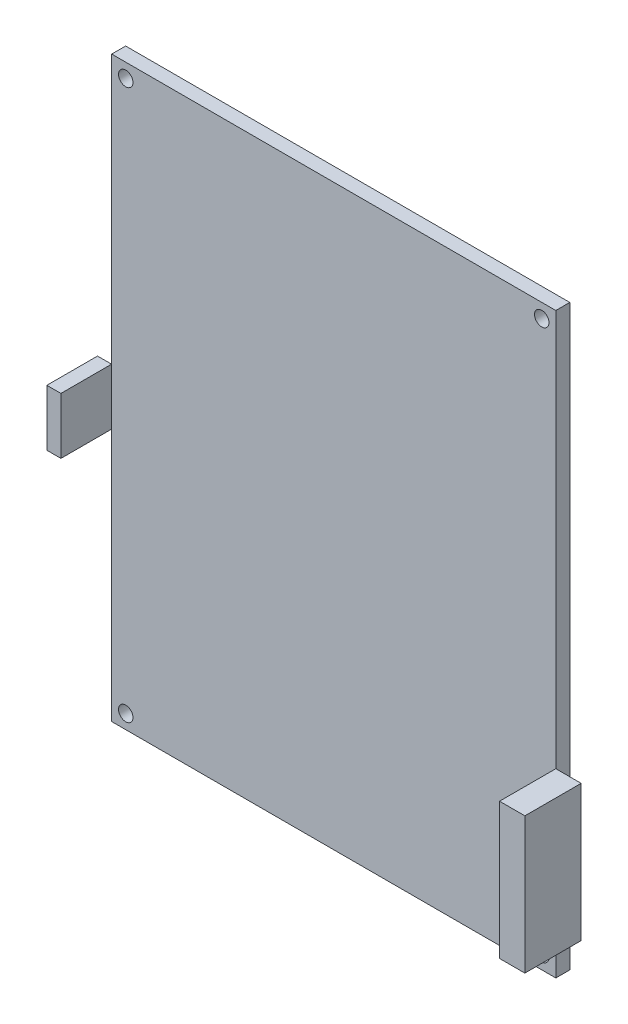
ISO-10303-21;
HEADER;
FILE_DESCRIPTION(('STEP AP214'),'2;1');
FILE_NAME('part.step','',(''),(''),'','','');
FILE_SCHEMA(('AUTOMOTIVE_DESIGN { 1 0 10303 214 1 1 1 1 }'));
ENDSEC;
DATA;
#1=APPLICATION_CONTEXT('core data for automotive mechanical design processes');
#2=APPLICATION_PROTOCOL_DEFINITION('international standard','automotive_design',2000,#1);
#3=PRODUCT_CONTEXT('',#1,'mechanical');
#4=PRODUCT('Part','Part','',(#3));
#5=PRODUCT_RELATED_PRODUCT_CATEGORY('part','',(#4));
#6=PRODUCT_DEFINITION_FORMATION('','',#4);
#7=PRODUCT_DEFINITION_CONTEXT('part definition',#1,'design');
#8=PRODUCT_DEFINITION('design','',#6,#7);
#9=PRODUCT_DEFINITION_SHAPE('','',#8);
#10=(LENGTH_UNIT() NAMED_UNIT(*) SI_UNIT(.MILLI.,.METRE.));
#11=(NAMED_UNIT(*) PLANE_ANGLE_UNIT() SI_UNIT($,.RADIAN.));
#12=(NAMED_UNIT(*) SI_UNIT($,.STERADIAN.) SOLID_ANGLE_UNIT());
#13=UNCERTAINTY_MEASURE_WITH_UNIT(LENGTH_MEASURE(1.E-05),#10,'distance_accuracy_value','');
#14=(GEOMETRIC_REPRESENTATION_CONTEXT(3) GLOBAL_UNCERTAINTY_ASSIGNED_CONTEXT((#13)) GLOBAL_UNIT_ASSIGNED_CONTEXT((#10,
#11,#12)) REPRESENTATION_CONTEXT('',''));
#15=CARTESIAN_POINT('',(0.,0.,0.));
#16=DIRECTION('',(0.,0.,1.));
#17=DIRECTION('',(1.,0.,0.));
#18=AXIS2_PLACEMENT_3D('',#15,#16,#17);
#19=CARTESIAN_POINT('',(55.8165,-55.0545,3.1496));
#20=DIRECTION('',(0.,0.,1.));
#21=DIRECTION('',(1.,0.,0.));
#22=AXIS2_PLACEMENT_3D('',#19,#20,#21);
#23=PLANE('',#22);
#24=DIRECTION('',(0.,1.,0.));
#25=VECTOR('',#24,1.);
#26=CARTESIAN_POINT('',(50.1015,-55.0545,3.1496));
#27=LINE('',#26,#25);
#28=CARTESIAN_POINT('',(50.1015,-55.0545,3.1496));
#29=VERTEX_POINT('',#28);
#30=CARTESIAN_POINT('',(50.1015,-24.3205,3.1496));
#31=VERTEX_POINT('',#30);
#32=EDGE_CURVE('E115',#29,#31,#27,.T.);
#33=ORIENTED_EDGE('',*,*,#32,.T.);
#34=DIRECTION('',(-1.,0.,0.));
#35=VECTOR('',#34,1.);
#36=CARTESIAN_POINT('',(55.8165,-24.3205,3.1496));
#37=LINE('',#36,#35);
#38=CARTESIAN_POINT('',(55.8165,-24.3205,3.1496));
#39=VERTEX_POINT('',#38);
#40=EDGE_CURVE('E12',#39,#31,#37,.T.);
#41=ORIENTED_EDGE('',*,*,#40,.F.);
#42=DIRECTION('',(0.,1.,0.));
#43=VECTOR('',#42,1.);
#44=CARTESIAN_POINT('',(55.8165,-55.0545,3.1496));
#45=LINE('',#44,#43);
#46=CARTESIAN_POINT('',(55.8165,-55.0545,3.1496));
#47=VERTEX_POINT('',#46);
#48=EDGE_CURVE('E100',#47,#39,#45,.T.);
#49=ORIENTED_EDGE('',*,*,#48,.F.);
#50=DIRECTION('',(-1.,0.,0.));
#51=VECTOR('',#50,1.);
#52=CARTESIAN_POINT('',(55.8165,-55.0545,3.1496));
#53=LINE('',#52,#51);
#54=EDGE_CURVE('E111',#47,#29,#53,.T.);
#55=ORIENTED_EDGE('',*,*,#54,.T.);
#56=EDGE_LOOP('',(#33,#41,#49,#55));
#57=FACE_BOUND('',#56,.T.);
#58=ADVANCED_FACE('F49',(#57),#23,.F.);
#59=CARTESIAN_POINT('',(55.8165,-24.3205,3.1496));
#60=DIRECTION('',(0.,-1.,0.));
#61=DIRECTION('',(0.,0.,-1.));
#62=AXIS2_PLACEMENT_3D('',#59,#60,#61);
#63=PLANE('',#62);
#64=DIRECTION('',(0.,0.,1.));
#65=VECTOR('',#64,1.);
#66=CARTESIAN_POINT('',(50.1015,-24.3205,3.1496));
#67=LINE('',#66,#65);
#68=CARTESIAN_POINT('',(50.1015,-24.3205,15.8496));
#69=VERTEX_POINT('',#68);
#70=EDGE_CURVE('E104',#31,#69,#67,.T.);
#71=ORIENTED_EDGE('',*,*,#70,.T.);
#72=DIRECTION('',(-1.,0.,0.));
#73=VECTOR('',#72,1.);
#74=CARTESIAN_POINT('',(55.8165,-24.3205,15.8496));
#75=LINE('',#74,#73);
#76=CARTESIAN_POINT('',(55.8165,-24.3205,15.8496));
#77=VERTEX_POINT('',#76);
#78=EDGE_CURVE('E57',#77,#69,#75,.T.);
#79=ORIENTED_EDGE('',*,*,#78,.F.);
#80=DIRECTION('',(0.,0.,1.));
#81=VECTOR('',#80,1.);
#82=CARTESIAN_POINT('',(55.8165,-24.3205,3.1496));
#83=LINE('',#82,#81);
#84=EDGE_CURVE('E95',#39,#77,#83,.T.);
#85=ORIENTED_EDGE('',*,*,#84,.F.);
#86=ORIENTED_EDGE('',*,*,#40,.T.);
#87=EDGE_LOOP('',(#71,#79,#85,#86));
#88=FACE_BOUND('',#87,.T.);
#89=ADVANCED_FACE('F103',(#88),#63,.F.);
#90=CARTESIAN_POINT('',(55.8165,-55.0545,15.8496));
#91=DIRECTION('',(0.,0.,-1.));
#92=DIRECTION('',(0.,1.,0.));
#93=AXIS2_PLACEMENT_3D('',#90,#91,#92);
#94=PLANE('',#93);
#95=DIRECTION('',(0.,-1.,0.));
#96=VECTOR('',#95,1.);
#97=CARTESIAN_POINT('',(50.1015,-55.0545,15.8496));
#98=LINE('',#97,#96);
#99=CARTESIAN_POINT('',(50.1015,-55.0545,15.8496));
#100=VERTEX_POINT('',#99);
#101=EDGE_CURVE('E82',#69,#100,#98,.T.);
#102=ORIENTED_EDGE('',*,*,#101,.T.);
#103=DIRECTION('',(-1.,0.,0.));
#104=VECTOR('',#103,1.);
#105=CARTESIAN_POINT('',(55.8165,-55.0545,15.8496));
#106=LINE('',#105,#104);
#107=CARTESIAN_POINT('',(55.8165,-55.0545,15.8496));
#108=VERTEX_POINT('',#107);
#109=EDGE_CURVE('E106',#108,#100,#106,.T.);
#110=ORIENTED_EDGE('',*,*,#109,.F.);
#111=DIRECTION('',(0.,-1.,0.));
#112=VECTOR('',#111,1.);
#113=CARTESIAN_POINT('',(55.8165,-55.0545,15.8496));
#114=LINE('',#113,#112);
#115=EDGE_CURVE('E98',#77,#108,#114,.T.);
#116=ORIENTED_EDGE('',*,*,#115,.F.);
#117=ORIENTED_EDGE('',*,*,#78,.T.);
#118=EDGE_LOOP('',(#102,#110,#116,#117));
#119=FACE_BOUND('',#118,.T.);
#120=ADVANCED_FACE('F107',(#119),#94,.F.);
#121=CARTESIAN_POINT('',(55.8165,-55.0545,3.1496));
#122=DIRECTION('',(0.,1.,0.));
#123=DIRECTION('',(0.,0.,1.));
#124=AXIS2_PLACEMENT_3D('',#121,#122,#123);
#125=PLANE('',#124);
#126=DIRECTION('',(0.,0.,-1.));
#127=VECTOR('',#126,1.);
#128=CARTESIAN_POINT('',(50.1015,-55.0545,3.1496));
#129=LINE('',#128,#127);
#130=EDGE_CURVE('E88',#100,#29,#129,.T.);
#131=ORIENTED_EDGE('',*,*,#130,.T.);
#132=ORIENTED_EDGE('',*,*,#54,.F.);
#133=DIRECTION('',(0.,0.,-1.));
#134=VECTOR('',#133,1.);
#135=CARTESIAN_POINT('',(55.8165,-55.0545,3.1496));
#136=LINE('',#135,#134);
#137=EDGE_CURVE('E65',#108,#47,#136,.T.);
#138=ORIENTED_EDGE('',*,*,#137,.F.);
#139=ORIENTED_EDGE('',*,*,#109,.T.);
#140=EDGE_LOOP('',(#131,#132,#138,#139));
#141=FACE_BOUND('',#140,.T.);
#142=ADVANCED_FACE('F123',(#141),#125,.F.);
#143=CARTESIAN_POINT('',(55.8165,-24.3205,3.1496));
#144=DIRECTION('',(1.,0.,0.));
#145=DIRECTION('',(0.,0.,-1.));
#146=AXIS2_PLACEMENT_3D('',#143,#144,#145);
#147=PLANE('',#146);
#148=ORIENTED_EDGE('',*,*,#48,.T.);
#149=ORIENTED_EDGE('',*,*,#84,.T.);
#150=ORIENTED_EDGE('',*,*,#115,.T.);
#151=ORIENTED_EDGE('',*,*,#137,.T.);
#152=EDGE_LOOP('',(#148,#149,#150,#151));
#153=FACE_BOUND('',#152,.T.);
#154=ADVANCED_FACE('F96',(#153),#147,.T.);
#155=CARTESIAN_POINT('',(50.1015,-24.3205,3.1496));
#156=DIRECTION('',(1.,0.,0.));
#157=DIRECTION('',(0.,0.,-1.));
#158=AXIS2_PLACEMENT_3D('',#155,#156,#157);
#159=PLANE('',#158);
#160=ORIENTED_EDGE('',*,*,#32,.F.);
#161=ORIENTED_EDGE('',*,*,#130,.F.);
#162=ORIENTED_EDGE('',*,*,#101,.F.);
#163=ORIENTED_EDGE('',*,*,#70,.F.);
#164=EDGE_LOOP('',(#160,#161,#162,#163));
#165=FACE_BOUND('',#164,.T.);
#166=ADVANCED_FACE('F126',(#165),#159,.F.);
#167=CLOSED_SHELL('',(#58,#89,#120,#142,#154,#166));
#168=MANIFOLD_SOLID_BREP('B2',#167);
#169=CARTESIAN_POINT('',(-53.2765,4.6355,3.175));
#170=DIRECTION('',(0.,0.,1.));
#171=DIRECTION('',(0.,-1.,0.));
#172=AXIS2_PLACEMENT_3D('',#169,#170,#171);
#173=PLANE('',#172);
#174=DIRECTION('',(0.,-1.,0.));
#175=VECTOR('',#174,1.);
#176=CARTESIAN_POINT('',(-50.1015,4.6355,3.175));
#177=LINE('',#176,#175);
#178=CARTESIAN_POINT('',(-50.1015,4.6355,3.175));
#179=VERTEX_POINT('',#178);
#180=CARTESIAN_POINT('',(-50.1015,-8.0645,3.175));
#181=VERTEX_POINT('',#180);
#182=EDGE_CURVE('E248',#179,#181,#177,.T.);
#183=ORIENTED_EDGE('',*,*,#182,.T.);
#184=DIRECTION('',(1.,0.,0.));
#185=VECTOR('',#184,1.);
#186=CARTESIAN_POINT('',(-53.2765,-8.0645,3.175));
#187=LINE('',#186,#185);
#188=CARTESIAN_POINT('',(-53.2765,-8.0645,3.175));
#189=VERTEX_POINT('',#188);
#190=EDGE_CURVE('E47',#189,#181,#187,.T.);
#191=ORIENTED_EDGE('',*,*,#190,.F.);
#192=DIRECTION('',(0.,-1.,0.));
#193=VECTOR('',#192,1.);
#194=CARTESIAN_POINT('',(-53.2765,4.6355,3.175));
#195=LINE('',#194,#193);
#196=CARTESIAN_POINT('',(-53.2765,4.6355,3.175));
#197=VERTEX_POINT('',#196);
#198=EDGE_CURVE('E236',#197,#189,#195,.T.);
#199=ORIENTED_EDGE('',*,*,#198,.F.);
#200=DIRECTION('',(1.,0.,0.));
#201=VECTOR('',#200,1.);
#202=CARTESIAN_POINT('',(-53.2765,4.6355,3.175));
#203=LINE('',#202,#201);
#204=EDGE_CURVE('E244',#197,#179,#203,.T.);
#205=ORIENTED_EDGE('',*,*,#204,.T.);
#206=EDGE_LOOP('',(#183,#191,#199,#205));
#207=FACE_BOUND('',#206,.T.);
#208=ADVANCED_FACE('F185',(#207),#173,.F.);
#209=CARTESIAN_POINT('',(-53.2765,-8.0645,3.175));
#210=DIRECTION('',(0.,1.,0.));
#211=DIRECTION('',(0.,0.,1.));
#212=AXIS2_PLACEMENT_3D('',#209,#210,#211);
#213=PLANE('',#212);
#214=DIRECTION('',(0.,0.,1.));
#215=VECTOR('',#214,1.);
#216=CARTESIAN_POINT('',(-50.1015,-8.0645,3.175));
#217=LINE('',#216,#215);
#218=CARTESIAN_POINT('',(-50.1015,-8.0645,14.605));
#219=VERTEX_POINT('',#218);
#220=EDGE_CURVE('E240',#181,#219,#217,.T.);
#221=ORIENTED_EDGE('',*,*,#220,.T.);
#222=DIRECTION('',(1.,0.,0.));
#223=VECTOR('',#222,1.);
#224=CARTESIAN_POINT('',(-53.2765,-8.0645,14.605));
#225=LINE('',#224,#223);
#226=CARTESIAN_POINT('',(-53.2765,-8.0645,14.605));
#227=VERTEX_POINT('',#226);
#228=EDGE_CURVE('E193',#227,#219,#225,.T.);
#229=ORIENTED_EDGE('',*,*,#228,.F.);
#230=DIRECTION('',(0.,0.,1.));
#231=VECTOR('',#230,1.);
#232=CARTESIAN_POINT('',(-53.2765,-8.0645,3.175));
#233=LINE('',#232,#231);
#234=EDGE_CURVE('E231',#189,#227,#233,.T.);
#235=ORIENTED_EDGE('',*,*,#234,.F.);
#236=ORIENTED_EDGE('',*,*,#190,.T.);
#237=EDGE_LOOP('',(#221,#229,#235,#236));
#238=FACE_BOUND('',#237,.T.);
#239=ADVANCED_FACE('F239',(#238),#213,.F.);
#240=CARTESIAN_POINT('',(-53.2765,4.6355,14.605));
#241=DIRECTION('',(0.,0.,-1.));
#242=DIRECTION('',(0.,1.,0.));
#243=AXIS2_PLACEMENT_3D('',#240,#241,#242);
#244=PLANE('',#243);
#245=DIRECTION('',(0.,1.,0.));
#246=VECTOR('',#245,1.);
#247=CARTESIAN_POINT('',(-50.1015,4.6355,14.605));
#248=LINE('',#247,#246);
#249=CARTESIAN_POINT('',(-50.1015,4.6355,14.605));
#250=VERTEX_POINT('',#249);
#251=EDGE_CURVE('E218',#219,#250,#248,.T.);
#252=ORIENTED_EDGE('',*,*,#251,.T.);
#253=DIRECTION('',(1.,0.,0.));
#254=VECTOR('',#253,1.);
#255=CARTESIAN_POINT('',(-53.2765,4.6355,14.605));
#256=LINE('',#255,#254);
#257=CARTESIAN_POINT('',(-53.2765,4.6355,14.605));
#258=VERTEX_POINT('',#257);
#259=EDGE_CURVE('E241',#258,#250,#256,.T.);
#260=ORIENTED_EDGE('',*,*,#259,.F.);
#261=DIRECTION('',(0.,1.,0.));
#262=VECTOR('',#261,1.);
#263=CARTESIAN_POINT('',(-53.2765,4.6355,14.605));
#264=LINE('',#263,#262);
#265=EDGE_CURVE('E234',#227,#258,#264,.T.);
#266=ORIENTED_EDGE('',*,*,#265,.F.);
#267=ORIENTED_EDGE('',*,*,#228,.T.);
#268=EDGE_LOOP('',(#252,#260,#266,#267));
#269=FACE_BOUND('',#268,.T.);
#270=ADVANCED_FACE('F242',(#269),#244,.F.);
#271=CARTESIAN_POINT('',(-53.2765,4.6355,3.175));
#272=DIRECTION('',(0.,-1.,0.));
#273=DIRECTION('',(0.,0.,-1.));
#274=AXIS2_PLACEMENT_3D('',#271,#272,#273);
#275=PLANE('',#274);
#276=DIRECTION('',(0.,0.,-1.));
#277=VECTOR('',#276,1.);
#278=CARTESIAN_POINT('',(-50.1015,4.6355,3.175));
#279=LINE('',#278,#277);
#280=EDGE_CURVE('E224',#250,#179,#279,.T.);
#281=ORIENTED_EDGE('',*,*,#280,.T.);
#282=ORIENTED_EDGE('',*,*,#204,.F.);
#283=DIRECTION('',(0.,0.,-1.));
#284=VECTOR('',#283,1.);
#285=CARTESIAN_POINT('',(-53.2765,4.6355,3.175));
#286=LINE('',#285,#284);
#287=EDGE_CURVE('E201',#258,#197,#286,.T.);
#288=ORIENTED_EDGE('',*,*,#287,.F.);
#289=ORIENTED_EDGE('',*,*,#259,.T.);
#290=EDGE_LOOP('',(#281,#282,#288,#289));
#291=FACE_BOUND('',#290,.T.);
#292=ADVANCED_FACE('F255',(#291),#275,.F.);
#293=CARTESIAN_POINT('',(-53.2765,-8.0645,3.175));
#294=DIRECTION('',(-1.,0.,0.));
#295=DIRECTION('',(0.,0.,1.));
#296=AXIS2_PLACEMENT_3D('',#293,#294,#295);
#297=PLANE('',#296);
#298=ORIENTED_EDGE('',*,*,#198,.T.);
#299=ORIENTED_EDGE('',*,*,#234,.T.);
#300=ORIENTED_EDGE('',*,*,#265,.T.);
#301=ORIENTED_EDGE('',*,*,#287,.T.);
#302=EDGE_LOOP('',(#298,#299,#300,#301));
#303=FACE_BOUND('',#302,.T.);
#304=ADVANCED_FACE('F232',(#303),#297,.T.);
#305=CARTESIAN_POINT('',(-50.1015,-8.0645,3.175));
#306=DIRECTION('',(-1.,0.,0.));
#307=DIRECTION('',(0.,0.,1.));
#308=AXIS2_PLACEMENT_3D('',#305,#306,#307);
#309=PLANE('',#308);
#310=ORIENTED_EDGE('',*,*,#182,.F.);
#311=ORIENTED_EDGE('',*,*,#280,.F.);
#312=ORIENTED_EDGE('',*,*,#251,.F.);
#313=ORIENTED_EDGE('',*,*,#220,.F.);
#314=EDGE_LOOP('',(#310,#311,#312,#313));
#315=FACE_BOUND('',#314,.T.);
#316=ADVANCED_FACE('F258',(#315),#309,.F.);
#317=CLOSED_SHELL('',(#208,#239,#270,#292,#304,#316));
#318=MANIFOLD_SOLID_BREP('B6',#317);
#319=CARTESIAN_POINT('',(50.1015,65.2145,0.));
#320=DIRECTION('',(0.,0.,-1.));
#321=DIRECTION('',(-1.,0.,0.));
#322=AXIS2_PLACEMENT_3D('',#319,#320,#321);
#323=PLANE('',#322);
#324=DIRECTION('',(0.,1.,0.));
#325=VECTOR('',#324,1.);
#326=CARTESIAN_POINT('',(50.1015,-65.2145,0.));
#327=LINE('',#326,#325);
#328=CARTESIAN_POINT('',(50.1015,-65.2145,0.));
#329=VERTEX_POINT('',#328);
#330=CARTESIAN_POINT('',(50.1015,65.2145,0.));
#331=VERTEX_POINT('',#330);
#332=EDGE_CURVE('E379',#329,#331,#327,.T.);
#333=ORIENTED_EDGE('',*,*,#332,.F.);
#334=DIRECTION('',(1.,0.,0.));
#335=VECTOR('',#334,1.);
#336=CARTESIAN_POINT('',(-50.1015,-65.2145,0.));
#337=LINE('',#336,#335);
#338=CARTESIAN_POINT('',(-50.1015,-65.2145,0.));
#339=VERTEX_POINT('',#338);
#340=EDGE_CURVE('E352',#339,#329,#337,.T.);
#341=ORIENTED_EDGE('',*,*,#340,.F.);
#342=DIRECTION('',(0.,-1.,0.));
#343=VECTOR('',#342,1.);
#344=CARTESIAN_POINT('',(-50.1015,-65.2145,0.));
#345=LINE('',#344,#343);
#346=CARTESIAN_POINT('',(-50.1015,65.2145,0.));
#347=VERTEX_POINT('',#346);
#348=EDGE_CURVE('E346',#347,#339,#345,.T.);
#349=ORIENTED_EDGE('',*,*,#348,.F.);
#350=DIRECTION('',(-1.,0.,0.));
#351=VECTOR('',#350,1.);
#352=CARTESIAN_POINT('',(-50.1015,65.2145,0.));
#353=LINE('',#352,#351);
#354=EDGE_CURVE('E368',#331,#347,#353,.T.);
#355=ORIENTED_EDGE('',*,*,#354,.F.);
#356=EDGE_LOOP('',(#333,#341,#349,#355));
#357=FACE_BOUND('',#356,.T.);
#358=CARTESIAN_POINT('',(-46.9265,-62.0395,0.));
#359=DIRECTION('',(0.,0.,1.));
#360=DIRECTION('',(1.,0.,0.));
#361=AXIS2_PLACEMENT_3D('',#358,#359,#360);
#362=CIRCLE('',#361,1.63195);
#363=CARTESIAN_POINT('',(-45.29455,-62.0395,0.));
#364=VERTEX_POINT('',#363);
#365=EDGE_CURVE('E383',#364,#364,#362,.T.);
#366=ORIENTED_EDGE('',*,*,#365,.T.);
#367=EDGE_LOOP('',(#366));
#368=FACE_BOUND('',#367,.T.);
#369=CARTESIAN_POINT('',(-46.9265,62.0395,0.));
#370=DIRECTION('',(0.,0.,1.));
#371=DIRECTION('',(1.,0.,0.));
#372=AXIS2_PLACEMENT_3D('',#369,#370,#371);
#373=CIRCLE('',#372,1.63195);
#374=CARTESIAN_POINT('',(-45.29455,62.0395,0.));
#375=VERTEX_POINT('',#374);
#376=EDGE_CURVE('E406',#375,#375,#373,.T.);
#377=ORIENTED_EDGE('',*,*,#376,.T.);
#378=EDGE_LOOP('',(#377));
#379=FACE_BOUND('',#378,.T.);
#380=CARTESIAN_POINT('',(46.9265,-62.0395,0.));
#381=DIRECTION('',(0.,0.,1.));
#382=DIRECTION('',(1.,0.,0.));
#383=AXIS2_PLACEMENT_3D('',#380,#381,#382);
#384=CIRCLE('',#383,1.63195);
#385=CARTESIAN_POINT('',(48.55845,-62.0395,0.));
#386=VERTEX_POINT('',#385);
#387=EDGE_CURVE('E412',#386,#386,#384,.T.);
#388=ORIENTED_EDGE('',*,*,#387,.T.);
#389=EDGE_LOOP('',(#388));
#390=FACE_BOUND('',#389,.T.);
#391=CARTESIAN_POINT('',(46.9265,62.0395,0.));
#392=DIRECTION('',(0.,0.,1.));
#393=DIRECTION('',(1.,0.,0.));
#394=AXIS2_PLACEMENT_3D('',#391,#392,#393);
#395=CIRCLE('',#394,1.63195);
#396=CARTESIAN_POINT('',(48.55845,62.0395,0.));
#397=VERTEX_POINT('',#396);
#398=EDGE_CURVE('E419',#397,#397,#395,.T.);
#399=ORIENTED_EDGE('',*,*,#398,.T.);
#400=EDGE_LOOP('',(#399));
#401=FACE_BOUND('',#400,.T.);
#402=ADVANCED_FACE('F308',(#357,#368,#379,#390,#401),#323,.T.);
#403=CARTESIAN_POINT('',(50.1015,-65.2145,3.1496));
#404=DIRECTION('',(-1.,0.,0.));
#405=DIRECTION('',(0.,0.,1.));
#406=AXIS2_PLACEMENT_3D('',#403,#404,#405);
#407=PLANE('',#406);
#408=ORIENTED_EDGE('',*,*,#332,.T.);
#409=DIRECTION('',(0.,0.,-1.));
#410=VECTOR('',#409,1.);
#411=CARTESIAN_POINT('',(50.1015,65.2145,3.1496));
#412=LINE('',#411,#410);
#413=CARTESIAN_POINT('',(50.1015,65.2145,3.1496));
#414=VERTEX_POINT('',#413);
#415=EDGE_CURVE('E183',#414,#331,#412,.T.);
#416=ORIENTED_EDGE('',*,*,#415,.F.);
#417=DIRECTION('',(0.,1.,0.));
#418=VECTOR('',#417,1.);
#419=CARTESIAN_POINT('',(50.1015,-65.2145,3.1496));
#420=LINE('',#419,#418);
#421=CARTESIAN_POINT('',(50.1015,-65.2145,3.1496));
#422=VERTEX_POINT('',#421);
#423=EDGE_CURVE('E357',#422,#414,#420,.T.);
#424=ORIENTED_EDGE('',*,*,#423,.F.);
#425=DIRECTION('',(0.,0.,-1.));
#426=VECTOR('',#425,1.);
#427=CARTESIAN_POINT('',(50.1015,-65.2145,3.1496));
#428=LINE('',#427,#426);
#429=EDGE_CURVE('E375',#422,#329,#428,.T.);
#430=ORIENTED_EDGE('',*,*,#429,.T.);
#431=EDGE_LOOP('',(#408,#416,#424,#430));
#432=FACE_BOUND('',#431,.T.);
#433=ADVANCED_FACE('F310',(#432),#407,.F.);
#434=CARTESIAN_POINT('',(-50.1015,65.2145,3.1496));
#435=DIRECTION('',(0.,-1.,0.));
#436=DIRECTION('',(0.,0.,-1.));
#437=AXIS2_PLACEMENT_3D('',#434,#435,#436);
#438=PLANE('',#437);
#439=ORIENTED_EDGE('',*,*,#354,.T.);
#440=DIRECTION('',(0.,0.,-1.));
#441=VECTOR('',#440,1.);
#442=CARTESIAN_POINT('',(-50.1015,65.2145,3.1496));
#443=LINE('',#442,#441);
#444=CARTESIAN_POINT('',(-50.1015,65.2145,3.1496));
#445=VERTEX_POINT('',#444);
#446=EDGE_CURVE('E317',#445,#347,#443,.T.);
#447=ORIENTED_EDGE('',*,*,#446,.F.);
#448=DIRECTION('',(-1.,0.,0.));
#449=VECTOR('',#448,1.);
#450=CARTESIAN_POINT('',(-50.1015,65.2145,3.1496));
#451=LINE('',#450,#449);
#452=EDGE_CURVE('E359',#414,#445,#451,.T.);
#453=ORIENTED_EDGE('',*,*,#452,.F.);
#454=ORIENTED_EDGE('',*,*,#415,.T.);
#455=EDGE_LOOP('',(#439,#447,#453,#454));
#456=FACE_BOUND('',#455,.T.);
#457=ADVANCED_FACE('F367',(#456),#438,.F.);
#458=CARTESIAN_POINT('',(-50.1015,-65.2145,3.1496));
#459=DIRECTION('',(1.,0.,0.));
#460=DIRECTION('',(0.,0.,-1.));
#461=AXIS2_PLACEMENT_3D('',#458,#459,#460);
#462=PLANE('',#461);
#463=ORIENTED_EDGE('',*,*,#348,.T.);
#464=DIRECTION('',(0.,0.,-1.));
#465=VECTOR('',#464,1.);
#466=CARTESIAN_POINT('',(-50.1015,-65.2145,3.1496));
#467=LINE('',#466,#465);
#468=CARTESIAN_POINT('',(-50.1015,-65.2145,3.1496));
#469=VERTEX_POINT('',#468);
#470=EDGE_CURVE('E369',#469,#339,#467,.T.);
#471=ORIENTED_EDGE('',*,*,#470,.F.);
#472=DIRECTION('',(0.,-1.,0.));
#473=VECTOR('',#472,1.);
#474=CARTESIAN_POINT('',(-50.1015,-65.2145,3.1496));
#475=LINE('',#474,#473);
#476=EDGE_CURVE('E363',#445,#469,#475,.T.);
#477=ORIENTED_EDGE('',*,*,#476,.F.);
#478=ORIENTED_EDGE('',*,*,#446,.T.);
#479=EDGE_LOOP('',(#463,#471,#477,#478));
#480=FACE_BOUND('',#479,.T.);
#481=ADVANCED_FACE('F370',(#480),#462,.F.);
#482=CARTESIAN_POINT('',(-50.1015,-65.2145,3.1496));
#483=DIRECTION('',(0.,1.,0.));
#484=DIRECTION('',(0.,0.,1.));
#485=AXIS2_PLACEMENT_3D('',#482,#483,#484);
#486=PLANE('',#485);
#487=ORIENTED_EDGE('',*,*,#340,.T.);
#488=ORIENTED_EDGE('',*,*,#429,.F.);
#489=DIRECTION('',(1.,0.,0.));
#490=VECTOR('',#489,1.);
#491=CARTESIAN_POINT('',(-50.1015,-65.2145,3.1496));
#492=LINE('',#491,#490);
#493=EDGE_CURVE('E328',#469,#422,#492,.T.);
#494=ORIENTED_EDGE('',*,*,#493,.F.);
#495=ORIENTED_EDGE('',*,*,#470,.T.);
#496=EDGE_LOOP('',(#487,#488,#494,#495));
#497=FACE_BOUND('',#496,.T.);
#498=ADVANCED_FACE('F392',(#497),#486,.F.);
#499=CARTESIAN_POINT('',(50.1015,65.2145,3.1496));
#500=DIRECTION('',(0.,0.,-1.));
#501=DIRECTION('',(-1.,0.,0.));
#502=AXIS2_PLACEMENT_3D('',#499,#500,#501);
#503=PLANE('',#502);
#504=CARTESIAN_POINT('',(46.9265,62.0395,3.1496));
#505=DIRECTION('',(0.,0.,1.));
#506=DIRECTION('',(1.,0.,0.));
#507=AXIS2_PLACEMENT_3D('',#504,#505,#506);
#508=CIRCLE('',#507,1.63194999999999);
#509=CARTESIAN_POINT('',(48.55845,62.0395,3.1496));
#510=VERTEX_POINT('',#509);
#511=EDGE_CURVE('E422',#510,#510,#508,.T.);
#512=ORIENTED_EDGE('',*,*,#511,.F.);
#513=EDGE_LOOP('',(#512));
#514=FACE_BOUND('',#513,.T.);
#515=CARTESIAN_POINT('',(46.9265,-62.0395,3.1496));
#516=DIRECTION('',(0.,0.,1.));
#517=DIRECTION('',(1.,0.,0.));
#518=AXIS2_PLACEMENT_3D('',#515,#516,#517);
#519=CIRCLE('',#518,1.63194999999999);
#520=CARTESIAN_POINT('',(48.55845,-62.0395,3.1496));
#521=VERTEX_POINT('',#520);
#522=EDGE_CURVE('E415',#521,#521,#519,.T.);
#523=ORIENTED_EDGE('',*,*,#522,.F.);
#524=EDGE_LOOP('',(#523));
#525=FACE_BOUND('',#524,.T.);
#526=CARTESIAN_POINT('',(-46.9265,62.0395,3.1496));
#527=DIRECTION('',(0.,0.,1.));
#528=DIRECTION('',(1.,0.,0.));
#529=AXIS2_PLACEMENT_3D('',#526,#527,#528);
#530=CIRCLE('',#529,1.63194999999999);
#531=CARTESIAN_POINT('',(-45.29455,62.0395,3.1496));
#532=VERTEX_POINT('',#531);
#533=EDGE_CURVE('E409',#532,#532,#530,.T.);
#534=ORIENTED_EDGE('',*,*,#533,.F.);
#535=EDGE_LOOP('',(#534));
#536=FACE_BOUND('',#535,.T.);
#537=CARTESIAN_POINT('',(-46.9265,-62.0395,3.1496));
#538=DIRECTION('',(0.,0.,1.));
#539=DIRECTION('',(1.,0.,0.));
#540=AXIS2_PLACEMENT_3D('',#537,#538,#539);
#541=CIRCLE('',#540,1.63194999999999);
#542=CARTESIAN_POINT('',(-45.29455,-62.0395,3.1496));
#543=VERTEX_POINT('',#542);
#544=EDGE_CURVE('E402',#543,#543,#541,.T.);
#545=ORIENTED_EDGE('',*,*,#544,.F.);
#546=EDGE_LOOP('',(#545));
#547=FACE_BOUND('',#546,.T.);
#548=ORIENTED_EDGE('',*,*,#423,.T.);
#549=ORIENTED_EDGE('',*,*,#452,.T.);
#550=ORIENTED_EDGE('',*,*,#476,.T.);
#551=ORIENTED_EDGE('',*,*,#493,.T.);
#552=EDGE_LOOP('',(#548,#549,#550,#551));
#553=FACE_BOUND('',#552,.T.);
#554=ADVANCED_FACE('F361',(#514,#525,#536,#547,#553),#503,.F.);
#555=CARTESIAN_POINT('',(-46.9265,-62.0395,3.1496));
#556=DIRECTION('',(0.,0.,1.));
#557=DIRECTION('',(1.,0.,0.));
#558=AXIS2_PLACEMENT_3D('',#555,#556,#557);
#559=CYLINDRICAL_SURFACE('',#558,1.63194999999999);
#560=ORIENTED_EDGE('',*,*,#365,.F.);
#561=EDGE_LOOP('',(#560));
#562=FACE_BOUND('',#561,.T.);
#563=ORIENTED_EDGE('',*,*,#544,.T.);
#564=EDGE_LOOP('',(#563));
#565=FACE_BOUND('',#564,.T.);
#566=ADVANCED_FACE('F430',(#562,#565),#559,.F.);
#567=CARTESIAN_POINT('',(-46.9265,62.0395,3.1496));
#568=DIRECTION('',(0.,0.,1.));
#569=DIRECTION('',(1.,0.,0.));
#570=AXIS2_PLACEMENT_3D('',#567,#568,#569);
#571=CYLINDRICAL_SURFACE('',#570,1.63194999999999);
#572=ORIENTED_EDGE('',*,*,#376,.F.);
#573=EDGE_LOOP('',(#572));
#574=FACE_BOUND('',#573,.T.);
#575=ORIENTED_EDGE('',*,*,#533,.T.);
#576=EDGE_LOOP('',(#575));
#577=FACE_BOUND('',#576,.T.);
#578=ADVANCED_FACE('F439',(#574,#577),#571,.F.);
#579=CARTESIAN_POINT('',(46.9265,-62.0395,3.1496));
#580=DIRECTION('',(0.,0.,1.));
#581=DIRECTION('',(1.,0.,0.));
#582=AXIS2_PLACEMENT_3D('',#579,#580,#581);
#583=CYLINDRICAL_SURFACE('',#582,1.63194999999999);
#584=ORIENTED_EDGE('',*,*,#387,.F.);
#585=EDGE_LOOP('',(#584));
#586=FACE_BOUND('',#585,.T.);
#587=ORIENTED_EDGE('',*,*,#522,.T.);
#588=EDGE_LOOP('',(#587));
#589=FACE_BOUND('',#588,.T.);
#590=ADVANCED_FACE('F445',(#586,#589),#583,.F.);
#591=CARTESIAN_POINT('',(46.9265,62.0395,3.1496));
#592=DIRECTION('',(0.,0.,1.));
#593=DIRECTION('',(1.,0.,0.));
#594=AXIS2_PLACEMENT_3D('',#591,#592,#593);
#595=CYLINDRICAL_SURFACE('',#594,1.63194999999999);
#596=ORIENTED_EDGE('',*,*,#398,.F.);
#597=EDGE_LOOP('',(#596));
#598=FACE_BOUND('',#597,.T.);
#599=ORIENTED_EDGE('',*,*,#511,.T.);
#600=EDGE_LOOP('',(#599));
#601=FACE_BOUND('',#600,.T.);
#602=ADVANCED_FACE('F426',(#598,#601),#595,.F.);
#603=CLOSED_SHELL('',(#402,#433,#457,#481,#498,#554,#566,#578,#590,#602));
#604=MANIFOLD_SOLID_BREP('B41',#603);
#605=ADVANCED_BREP_SHAPE_REPRESENTATION('',(#18,#168,#318,#604),#14);
#606=SHAPE_DEFINITION_REPRESENTATION(#9,#605);
ENDSEC;
END-ISO-10303-21;
